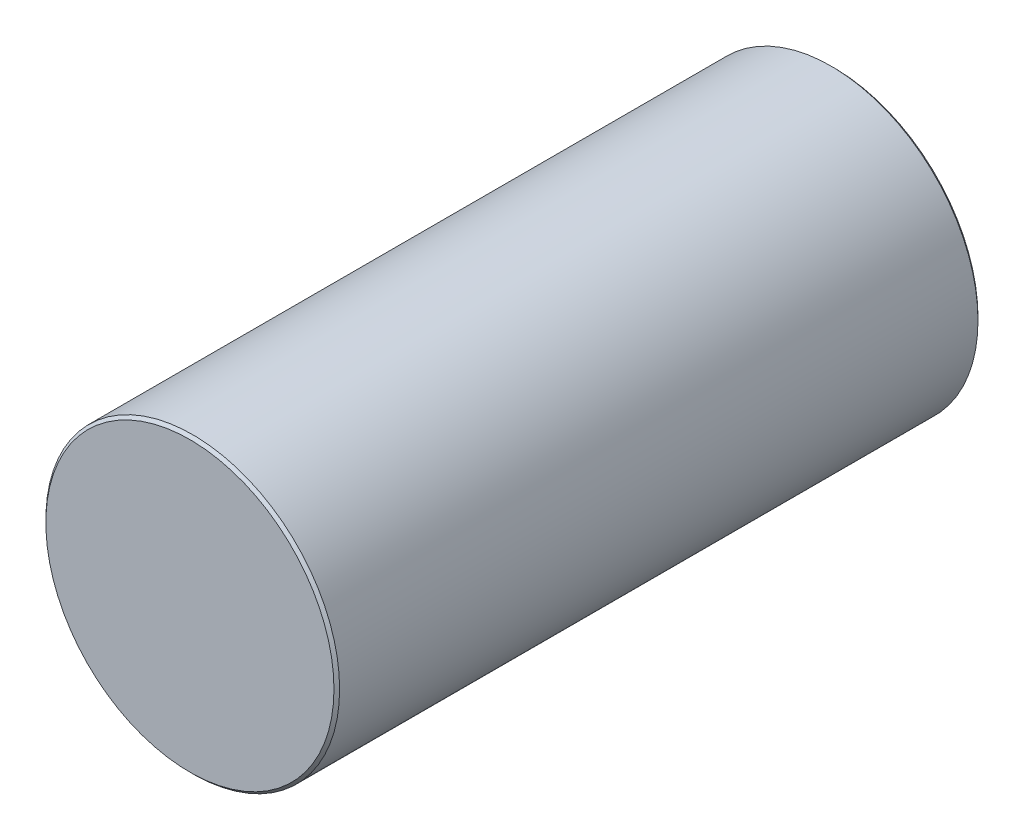
ISO-10303-21;
HEADER;
FILE_DESCRIPTION(('STEP AP214'),'2;1');
FILE_NAME('part.step','',(''),(''),'','','');
FILE_SCHEMA(('AUTOMOTIVE_DESIGN { 1 0 10303 214 1 1 1 1 }'));
ENDSEC;
DATA;
#1=APPLICATION_CONTEXT('core data for automotive mechanical design processes');
#2=APPLICATION_PROTOCOL_DEFINITION('international standard','automotive_design',2000,#1);
#3=PRODUCT_CONTEXT('',#1,'mechanical');
#4=PRODUCT('Part','Part','',(#3));
#5=PRODUCT_RELATED_PRODUCT_CATEGORY('part','',(#4));
#6=PRODUCT_DEFINITION_FORMATION('','',#4);
#7=PRODUCT_DEFINITION_CONTEXT('part definition',#1,'design');
#8=PRODUCT_DEFINITION('design','',#6,#7);
#9=PRODUCT_DEFINITION_SHAPE('','',#8);
#10=(LENGTH_UNIT() NAMED_UNIT(*) SI_UNIT(.MILLI.,.METRE.));
#11=(NAMED_UNIT(*) PLANE_ANGLE_UNIT() SI_UNIT($,.RADIAN.));
#12=(NAMED_UNIT(*) SI_UNIT($,.STERADIAN.) SOLID_ANGLE_UNIT());
#13=UNCERTAINTY_MEASURE_WITH_UNIT(LENGTH_MEASURE(1.E-05),#10,'distance_accuracy_value','');
#14=(GEOMETRIC_REPRESENTATION_CONTEXT(3) GLOBAL_UNCERTAINTY_ASSIGNED_CONTEXT((#13)) GLOBAL_UNIT_ASSIGNED_CONTEXT((#10,
#11,#12)) REPRESENTATION_CONTEXT('',''));
#15=CARTESIAN_POINT('',(0.,0.,0.));
#16=DIRECTION('',(0.,0.,1.));
#17=DIRECTION('',(1.,0.,0.));
#18=AXIS2_PLACEMENT_3D('',#15,#16,#17);
#19=CARTESIAN_POINT('',(0.,0.,11.4));
#20=DIRECTION('',(0.,0.,-1.));
#21=DIRECTION('',(-1.,0.,0.));
#22=AXIS2_PLACEMENT_3D('',#19,#20,#21);
#23=CYLINDRICAL_SURFACE('',#22,2.6);
#24=CARTESIAN_POINT('',(0.,0.,11.35));
#25=DIRECTION('',(0.,0.,1.));
#26=DIRECTION('',(1.,0.,0.));
#27=AXIS2_PLACEMENT_3D('',#24,#25,#26);
#28=CIRCLE('',#27,2.6);
#29=CARTESIAN_POINT('',(2.6,0.,11.35));
#30=VERTEX_POINT('',#29);
#31=EDGE_CURVE('E54',#30,#30,#28,.F.);
#32=ORIENTED_EDGE('',*,*,#31,.T.);
#33=EDGE_LOOP('',(#32));
#34=FACE_BOUND('',#33,.T.);
#35=CARTESIAN_POINT('',(0.,0.,0.049999999999998));
#36=DIRECTION('',(0.,0.,1.));
#37=DIRECTION('',(1.,0.,0.));
#38=AXIS2_PLACEMENT_3D('',#35,#36,#37);
#39=CIRCLE('',#38,2.6);
#40=CARTESIAN_POINT('',(2.6,0.,0.049999999999998));
#41=VERTEX_POINT('',#40);
#42=EDGE_CURVE('E59',#41,#41,#39,.T.);
#43=ORIENTED_EDGE('',*,*,#42,.T.);
#44=EDGE_LOOP('',(#43));
#45=FACE_BOUND('',#44,.T.);
#46=ADVANCED_FACE('F45',(#34,#45),#23,.T.);
#47=CARTESIAN_POINT('',(0.,0.,11.4));
#48=DIRECTION('',(0.,0.,1.));
#49=DIRECTION('',(1.,0.,0.));
#50=AXIS2_PLACEMENT_3D('',#47,#48,#49);
#51=PLANE('',#50);
#52=CARTESIAN_POINT('',(0.,0.,11.4));
#53=DIRECTION('',(0.,0.,1.));
#54=DIRECTION('',(1.,0.,0.));
#55=AXIS2_PLACEMENT_3D('',#52,#53,#54);
#56=CIRCLE('',#55,2.55);
#57=CARTESIAN_POINT('',(2.55,0.,11.4));
#58=VERTEX_POINT('',#57);
#59=EDGE_CURVE('E64',#58,#58,#56,.T.);
#60=ORIENTED_EDGE('',*,*,#59,.T.);
#61=EDGE_LOOP('',(#60));
#62=FACE_BOUND('',#61,.T.);
#63=ADVANCED_FACE('F71',(#62),#51,.T.);
#64=CARTESIAN_POINT('',(0.,0.,0.));
#65=DIRECTION('',(0.,0.,1.));
#66=DIRECTION('',(1.,0.,0.));
#67=AXIS2_PLACEMENT_3D('',#64,#65,#66);
#68=PLANE('',#67);
#69=CARTESIAN_POINT('',(0.,0.,0.));
#70=DIRECTION('',(0.,0.,1.));
#71=DIRECTION('',(1.,0.,0.));
#72=AXIS2_PLACEMENT_3D('',#69,#70,#71);
#73=CIRCLE('',#72,2.55);
#74=CARTESIAN_POINT('',(2.55,0.,0.));
#75=VERTEX_POINT('',#74);
#76=EDGE_CURVE('E10',#75,#75,#73,.F.);
#77=ORIENTED_EDGE('',*,*,#76,.T.);
#78=EDGE_LOOP('',(#77));
#79=FACE_BOUND('',#78,.T.);
#80=ADVANCED_FACE('F75',(#79),#68,.F.);
#81=CARTESIAN_POINT('',(0.,0.,11.4));
#82=DIRECTION('',(0.,0.,-1.));
#83=DIRECTION('',(-1.,0.,0.));
#84=AXIS2_PLACEMENT_3D('',#81,#82,#83);
#85=CONICAL_SURFACE('',#84,2.55,0.785398163397431);
#86=ORIENTED_EDGE('',*,*,#31,.F.);
#87=EDGE_LOOP('',(#86));
#88=FACE_BOUND('',#87,.T.);
#89=ORIENTED_EDGE('',*,*,#59,.F.);
#90=EDGE_LOOP('',(#89));
#91=FACE_BOUND('',#90,.T.);
#92=ADVANCED_FACE('F73',(#88,#91),#85,.T.);
#93=CARTESIAN_POINT('',(0.,0.,0.049999999999998));
#94=DIRECTION('',(0.,0.,1.));
#95=DIRECTION('',(1.,0.,0.));
#96=AXIS2_PLACEMENT_3D('',#93,#94,#95);
#97=CONICAL_SURFACE('',#96,2.6,0.785398163397457);
#98=ORIENTED_EDGE('',*,*,#76,.F.);
#99=EDGE_LOOP('',(#98));
#100=FACE_BOUND('',#99,.T.);
#101=ORIENTED_EDGE('',*,*,#42,.F.);
#102=EDGE_LOOP('',(#101));
#103=FACE_BOUND('',#102,.T.);
#104=ADVANCED_FACE('F48',(#100,#103),#97,.T.);
#105=CLOSED_SHELL('',(#46,#63,#80,#92,#104));
#106=MANIFOLD_SOLID_BREP('B2',#105);
#107=ADVANCED_BREP_SHAPE_REPRESENTATION('',(#18,#106),#14);
#108=SHAPE_DEFINITION_REPRESENTATION(#9,#107);
ENDSEC;
END-ISO-10303-21;
